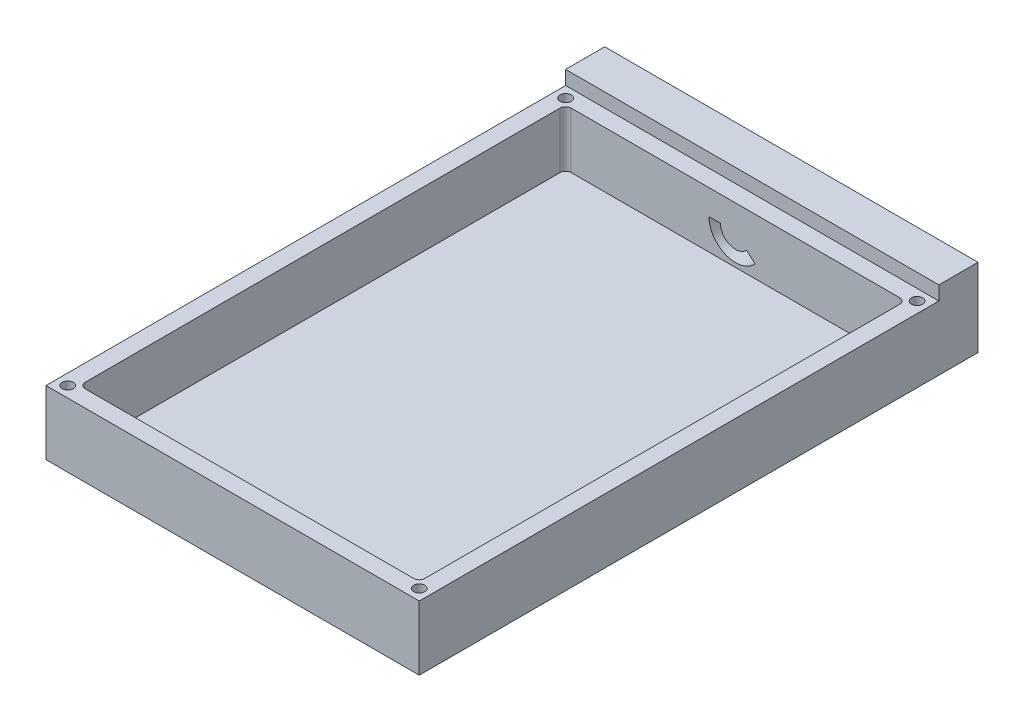
ISO-10303-21;
HEADER;
FILE_DESCRIPTION(('STEP AP214'),'2;1');
FILE_NAME('part.step','',(''),(''),'','','');
FILE_SCHEMA(('AUTOMOTIVE_DESIGN { 1 0 10303 214 1 1 1 1 }'));
ENDSEC;
DATA;
#1=APPLICATION_CONTEXT('core data for automotive mechanical design processes');
#2=APPLICATION_PROTOCOL_DEFINITION('international standard','automotive_design',2000,#1);
#3=PRODUCT_CONTEXT('',#1,'mechanical');
#4=PRODUCT('Part','Part','',(#3));
#5=PRODUCT_RELATED_PRODUCT_CATEGORY('part','',(#4));
#6=PRODUCT_DEFINITION_FORMATION('','',#4);
#7=PRODUCT_DEFINITION_CONTEXT('part definition',#1,'design');
#8=PRODUCT_DEFINITION('design','',#6,#7);
#9=PRODUCT_DEFINITION_SHAPE('','',#8);
#10=(LENGTH_UNIT() NAMED_UNIT(*) SI_UNIT(.MILLI.,.METRE.));
#11=(NAMED_UNIT(*) PLANE_ANGLE_UNIT() SI_UNIT($,.RADIAN.));
#12=(NAMED_UNIT(*) SI_UNIT($,.STERADIAN.) SOLID_ANGLE_UNIT());
#13=UNCERTAINTY_MEASURE_WITH_UNIT(LENGTH_MEASURE(1.E-05),#10,'distance_accuracy_value','');
#14=(GEOMETRIC_REPRESENTATION_CONTEXT(3) GLOBAL_UNCERTAINTY_ASSIGNED_CONTEXT((#13)) GLOBAL_UNIT_ASSIGNED_CONTEXT((#10,
#11,#12)) REPRESENTATION_CONTEXT('',''));
#15=CARTESIAN_POINT('',(0.,0.,0.));
#16=DIRECTION('',(0.,0.,1.));
#17=DIRECTION('',(1.,0.,0.));
#18=AXIS2_PLACEMENT_3D('',#15,#16,#17);
#19=CARTESIAN_POINT('',(0.,0.,0.));
#20=DIRECTION('',(0.,0.,1.));
#21=DIRECTION('',(1.,0.,0.));
#22=AXIS2_PLACEMENT_3D('',#19,#20,#21);
#23=PLANE('',#22);
#24=DIRECTION('',(0.,1.,0.));
#25=VECTOR('',#24,1.);
#26=CARTESIAN_POINT('',(33.4,7.,0.));
#27=LINE('',#26,#25);
#28=CARTESIAN_POINT('',(33.4,-7.,0.));
#29=VERTEX_POINT('',#28);
#30=CARTESIAN_POINT('',(33.4,7.,0.));
#31=VERTEX_POINT('',#30);
#32=EDGE_CURVE('E313',#29,#31,#27,.T.);
#33=ORIENTED_EDGE('',*,*,#32,.F.);
#34=DIRECTION('',(1.,0.,0.));
#35=VECTOR('',#34,1.);
#36=CARTESIAN_POINT('',(-33.4,-7.,0.));
#37=LINE('',#36,#35);
#38=CARTESIAN_POINT('',(-33.4,-7.,0.));
#39=VERTEX_POINT('',#38);
#40=EDGE_CURVE('E318',#39,#29,#37,.T.);
#41=ORIENTED_EDGE('',*,*,#40,.F.);
#42=DIRECTION('',(0.,-1.,0.));
#43=VECTOR('',#42,1.);
#44=CARTESIAN_POINT('',(-33.4,7.,0.));
#45=LINE('',#44,#43);
#46=CARTESIAN_POINT('',(-33.4,7.,0.));
#47=VERTEX_POINT('',#46);
#48=EDGE_CURVE('E332',#47,#39,#45,.T.);
#49=ORIENTED_EDGE('',*,*,#48,.F.);
#50=DIRECTION('',(-1.,0.,0.));
#51=VECTOR('',#50,1.);
#52=CARTESIAN_POINT('',(-33.4,7.,0.));
#53=LINE('',#52,#51);
#54=EDGE_CURVE('E329',#31,#47,#53,.T.);
#55=ORIENTED_EDGE('',*,*,#54,.F.);
#56=EDGE_LOOP('',(#33,#41,#49,#55));
#57=FACE_BOUND('',#56,.T.);
#58=CARTESIAN_POINT('',(0.,0.,0.));
#59=DIRECTION('',(0.,0.,1.));
#60=DIRECTION('',(1.,0.,0.));
#61=AXIS2_PLACEMENT_3D('',#58,#59,#60);
#62=CIRCLE('',#61,1.1);
#63=CARTESIAN_POINT('',(1.1,0.,0.));
#64=VERTEX_POINT('',#63);
#65=EDGE_CURVE('E309',#64,#64,#62,.T.);
#66=ORIENTED_EDGE('',*,*,#65,.T.);
#67=EDGE_LOOP('',(#66));
#68=FACE_BOUND('',#67,.T.);
#69=CARTESIAN_POINT('',(0.,0.,0.));
#70=DIRECTION('',(0.,0.,-1.));
#71=DIRECTION('',(-1.,0.,0.));
#72=AXIS2_PLACEMENT_3D('',#69,#70,#71);
#73=CIRCLE('',#72,4.75);
#74=CARTESIAN_POINT('',(3.5,-3.21130814466628,0.));
#75=VERTEX_POINT('',#74);
#76=CARTESIAN_POINT('',(-4.75,0.,0.));
#77=VERTEX_POINT('',#76);
#78=EDGE_CURVE('E198',#75,#77,#73,.T.);
#79=ORIENTED_EDGE('',*,*,#78,.F.);
#80=DIRECTION('',(0.736842105263144,-0.676064872561338,0.));
#81=VECTOR('',#80,1.);
#82=CARTESIAN_POINT('',(1.98947368421056,-1.82537515591554,0.));
#83=LINE('',#82,#81);
#84=CARTESIAN_POINT('',(1.98947368421056,-1.82537515591554,0.));
#85=VERTEX_POINT('',#84);
#86=EDGE_CURVE('E189',#85,#75,#83,.T.);
#87=ORIENTED_EDGE('',*,*,#86,.F.);
#88=CARTESIAN_POINT('',(0.,0.,0.));
#89=DIRECTION('',(0.,0.,1.));
#90=DIRECTION('',(-1.,0.,0.));
#91=AXIS2_PLACEMENT_3D('',#88,#89,#90);
#92=CIRCLE('',#91,2.7);
#93=CARTESIAN_POINT('',(-2.7,0.,0.));
#94=VERTEX_POINT('',#93);
#95=EDGE_CURVE('E202',#94,#85,#92,.T.);
#96=ORIENTED_EDGE('',*,*,#95,.F.);
#97=DIRECTION('',(1.,0.,0.));
#98=VECTOR('',#97,1.);
#99=CARTESIAN_POINT('',(-2.7,0.,0.));
#100=LINE('',#99,#98);
#101=EDGE_CURVE('E62',#77,#94,#100,.T.);
#102=ORIENTED_EDGE('',*,*,#101,.F.);
#103=EDGE_LOOP('',(#79,#87,#96,#102));
#104=FACE_BOUND('',#103,.T.);
#105=ADVANCED_FACE('F46',(#57,#68,#104),#23,.F.);
#106=CARTESIAN_POINT('',(30.4,4.5,9.99999999999999));
#107=DIRECTION('',(0.,0.,1.));
#108=DIRECTION('',(1.,0.,0.));
#109=AXIS2_PLACEMENT_3D('',#106,#107,#108);
#110=PLANE('',#109);
#111=DIRECTION('',(-1.,0.,0.));
#112=VECTOR('',#111,1.);
#113=CARTESIAN_POINT('',(30.4,-5.5,9.99999999999999));
#114=LINE('',#113,#112);
#115=CARTESIAN_POINT('',(29.4,-5.5,9.99999999999999));
#116=VERTEX_POINT('',#115);
#117=CARTESIAN_POINT('',(-29.4,-5.5,10.));
#118=VERTEX_POINT('',#117);
#119=EDGE_CURVE('E242',#116,#118,#114,.T.);
#120=ORIENTED_EDGE('',*,*,#119,.F.);
#121=DIRECTION('',(0.,-1.,0.));
#122=VECTOR('',#121,1.);
#123=CARTESIAN_POINT('',(29.4,4.5,9.99999999999999));
#124=LINE('',#123,#122);
#125=CARTESIAN_POINT('',(29.4,4.5,9.99999999999999));
#126=VERTEX_POINT('',#125);
#127=EDGE_CURVE('E389',#116,#126,#124,.F.);
#128=ORIENTED_EDGE('',*,*,#127,.T.);
#129=DIRECTION('',(-1.,0.,0.));
#130=VECTOR('',#129,1.);
#131=CARTESIAN_POINT('',(30.4,4.5,9.99999999999999));
#132=LINE('',#131,#130);
#133=CARTESIAN_POINT('',(-29.4,4.5,10.));
#134=VERTEX_POINT('',#133);
#135=EDGE_CURVE('E226',#126,#134,#132,.T.);
#136=ORIENTED_EDGE('',*,*,#135,.T.);
#137=DIRECTION('',(0.,-1.,0.));
#138=VECTOR('',#137,1.);
#139=CARTESIAN_POINT('',(-29.4,-5.5,10.));
#140=LINE('',#139,#138);
#141=EDGE_CURVE('E385',#134,#118,#140,.T.);
#142=ORIENTED_EDGE('',*,*,#141,.T.);
#143=EDGE_LOOP('',(#120,#128,#136,#142));
#144=FACE_BOUND('',#143,.T.);
#145=DIRECTION('',(0.736842105263144,-0.676064872561338,0.));
#146=VECTOR('',#145,1.);
#147=CARTESIAN_POINT('',(1.98947368421055,-1.82537515591554,10.));
#148=LINE('',#147,#146);
#149=CARTESIAN_POINT('',(1.98947368421056,-1.82537515591554,10.));
#150=VERTEX_POINT('',#149);
#151=CARTESIAN_POINT('',(3.5,-3.21130814466628,10.));
#152=VERTEX_POINT('',#151);
#153=EDGE_CURVE('E186',#150,#152,#148,.T.);
#154=ORIENTED_EDGE('',*,*,#153,.T.);
#155=CARTESIAN_POINT('',(0.,0.,10.));
#156=DIRECTION('',(0.,0.,1.));
#157=DIRECTION('',(1.,0.,0.));
#158=AXIS2_PLACEMENT_3D('',#155,#156,#157);
#159=CIRCLE('',#158,4.75);
#160=CARTESIAN_POINT('',(-4.75,0.,10.));
#161=VERTEX_POINT('',#160);
#162=EDGE_CURVE('E172',#152,#161,#159,.F.);
#163=ORIENTED_EDGE('',*,*,#162,.T.);
#164=DIRECTION('',(1.,0.,0.));
#165=VECTOR('',#164,1.);
#166=CARTESIAN_POINT('',(-2.7,0.,10.));
#167=LINE('',#166,#165);
#168=CARTESIAN_POINT('',(-2.7,0.,10.));
#169=VERTEX_POINT('',#168);
#170=EDGE_CURVE('E207',#161,#169,#167,.T.);
#171=ORIENTED_EDGE('',*,*,#170,.T.);
#172=CARTESIAN_POINT('',(0.,0.,10.));
#173=DIRECTION('',(0.,0.,1.));
#174=DIRECTION('',(1.,0.,0.));
#175=AXIS2_PLACEMENT_3D('',#172,#173,#174);
#176=CIRCLE('',#175,2.7);
#177=EDGE_CURVE('E194',#169,#150,#176,.T.);
#178=ORIENTED_EDGE('',*,*,#177,.T.);
#179=EDGE_LOOP('',(#154,#163,#171,#178));
#180=FACE_BOUND('',#179,.T.);
#181=ADVANCED_FACE('F193',(#144,#180),#110,.T.);
#182=CARTESIAN_POINT('',(0.,0.,7.));
#183=DIRECTION('',(0.,0.,1.));
#184=DIRECTION('',(1.,0.,0.));
#185=AXIS2_PLACEMENT_3D('',#182,#183,#184);
#186=PLANE('',#185);
#187=DIRECTION('',(-1.,0.,0.));
#188=VECTOR('',#187,1.);
#189=CARTESIAN_POINT('',(33.4,4.5,7.));
#190=LINE('',#189,#188);
#191=CARTESIAN_POINT('',(33.4,4.5,7.));
#192=VERTEX_POINT('',#191);
#193=CARTESIAN_POINT('',(-33.4,4.5,7.));
#194=VERTEX_POINT('',#193);
#195=EDGE_CURVE('E283',#192,#194,#190,.T.);
#196=ORIENTED_EDGE('',*,*,#195,.F.);
#197=DIRECTION('',(0.,1.,0.));
#198=VECTOR('',#197,1.);
#199=CARTESIAN_POINT('',(33.4,7.,7.));
#200=LINE('',#199,#198);
#201=CARTESIAN_POINT('',(33.4,7.,7.));
#202=VERTEX_POINT('',#201);
#203=EDGE_CURVE('E314',#192,#202,#200,.T.);
#204=ORIENTED_EDGE('',*,*,#203,.T.);
#205=DIRECTION('',(-1.,0.,0.));
#206=VECTOR('',#205,1.);
#207=CARTESIAN_POINT('',(-33.4,7.,7.));
#208=LINE('',#207,#206);
#209=CARTESIAN_POINT('',(-33.4,7.,7.));
#210=VERTEX_POINT('',#209);
#211=EDGE_CURVE('E317',#202,#210,#208,.T.);
#212=ORIENTED_EDGE('',*,*,#211,.T.);
#213=DIRECTION('',(0.,-1.,0.));
#214=VECTOR('',#213,1.);
#215=CARTESIAN_POINT('',(-33.4,7.,7.));
#216=LINE('',#215,#214);
#217=EDGE_CURVE('E321',#210,#194,#216,.T.);
#218=ORIENTED_EDGE('',*,*,#217,.T.);
#219=EDGE_LOOP('',(#196,#204,#212,#218));
#220=FACE_BOUND('',#219,.T.);
#221=ADVANCED_FACE('F456',(#220),#186,.T.);
#222=CARTESIAN_POINT('',(33.4,7.,7.));
#223=DIRECTION('',(-1.,0.,0.));
#224=DIRECTION('',(0.,0.,1.));
#225=AXIS2_PLACEMENT_3D('',#222,#223,#224);
#226=PLANE('',#225);
#227=ORIENTED_EDGE('',*,*,#203,.F.);
#228=DIRECTION('',(0.,0.,-1.));
#229=VECTOR('',#228,1.);
#230=CARTESIAN_POINT('',(33.4,4.5,100.));
#231=LINE('',#230,#229);
#232=CARTESIAN_POINT('',(33.4,4.5,100.));
#233=VERTEX_POINT('',#232);
#234=EDGE_CURVE('E277',#233,#192,#231,.T.);
#235=ORIENTED_EDGE('',*,*,#234,.F.);
#236=DIRECTION('',(0.,1.,0.));
#237=VECTOR('',#236,1.);
#238=CARTESIAN_POINT('',(33.4,-7.,100.));
#239=LINE('',#238,#237);
#240=CARTESIAN_POINT('',(33.4,-7.,100.));
#241=VERTEX_POINT('',#240);
#242=EDGE_CURVE('E306',#241,#233,#239,.T.);
#243=ORIENTED_EDGE('',*,*,#242,.F.);
#244=DIRECTION('',(0.,0.,-1.));
#245=VECTOR('',#244,1.);
#246=CARTESIAN_POINT('',(33.4,-7.,7.));
#247=LINE('',#246,#245);
#248=EDGE_CURVE('E325',#241,#29,#247,.T.);
#249=ORIENTED_EDGE('',*,*,#248,.T.);
#250=ORIENTED_EDGE('',*,*,#32,.T.);
#251=DIRECTION('',(0.,0.,-1.));
#252=VECTOR('',#251,1.);
#253=CARTESIAN_POINT('',(33.4,7.,7.));
#254=LINE('',#253,#252);
#255=EDGE_CURVE('E348',#202,#31,#254,.T.);
#256=ORIENTED_EDGE('',*,*,#255,.F.);
#257=EDGE_LOOP('',(#227,#235,#243,#249,#250,#256));
#258=FACE_BOUND('',#257,.T.);
#259=ADVANCED_FACE('F474',(#258),#226,.F.);
#260=CARTESIAN_POINT('',(-33.4,7.,7.));
#261=DIRECTION('',(0.,-1.,0.));
#262=DIRECTION('',(0.,0.,-1.));
#263=AXIS2_PLACEMENT_3D('',#260,#261,#262);
#264=PLANE('',#263);
#265=ORIENTED_EDGE('',*,*,#54,.T.);
#266=DIRECTION('',(0.,0.,-1.));
#267=VECTOR('',#266,1.);
#268=CARTESIAN_POINT('',(-33.4,7.,7.));
#269=LINE('',#268,#267);
#270=EDGE_CURVE('E344',#210,#47,#269,.T.);
#271=ORIENTED_EDGE('',*,*,#270,.F.);
#272=ORIENTED_EDGE('',*,*,#211,.F.);
#273=ORIENTED_EDGE('',*,*,#255,.T.);
#274=EDGE_LOOP('',(#265,#271,#272,#273));
#275=FACE_BOUND('',#274,.T.);
#276=ADVANCED_FACE('F471',(#275),#264,.F.);
#277=CARTESIAN_POINT('',(-33.4,7.,7.));
#278=DIRECTION('',(1.,0.,0.));
#279=DIRECTION('',(0.,0.,-1.));
#280=AXIS2_PLACEMENT_3D('',#277,#278,#279);
#281=PLANE('',#280);
#282=ORIENTED_EDGE('',*,*,#48,.T.);
#283=DIRECTION('',(0.,0.,-1.));
#284=VECTOR('',#283,1.);
#285=CARTESIAN_POINT('',(-33.4,-7.,7.));
#286=LINE('',#285,#284);
#287=CARTESIAN_POINT('',(-33.4,-7.,100.));
#288=VERTEX_POINT('',#287);
#289=EDGE_CURVE('E340',#288,#39,#286,.T.);
#290=ORIENTED_EDGE('',*,*,#289,.F.);
#291=DIRECTION('',(0.,-1.,0.));
#292=VECTOR('',#291,1.);
#293=CARTESIAN_POINT('',(-33.4,-7.,100.));
#294=LINE('',#293,#292);
#295=CARTESIAN_POINT('',(-33.4,4.5,100.));
#296=VERTEX_POINT('',#295);
#297=EDGE_CURVE('E298',#296,#288,#294,.T.);
#298=ORIENTED_EDGE('',*,*,#297,.F.);
#299=DIRECTION('',(0.,0.,1.));
#300=VECTOR('',#299,1.);
#301=CARTESIAN_POINT('',(-33.4,4.5,100.));
#302=LINE('',#301,#300);
#303=EDGE_CURVE('E286',#194,#296,#302,.T.);
#304=ORIENTED_EDGE('',*,*,#303,.F.);
#305=ORIENTED_EDGE('',*,*,#217,.F.);
#306=ORIENTED_EDGE('',*,*,#270,.T.);
#307=EDGE_LOOP('',(#282,#290,#298,#304,#305,#306));
#308=FACE_BOUND('',#307,.T.);
#309=ADVANCED_FACE('F467',(#308),#281,.F.);
#310=CARTESIAN_POINT('',(-33.4,-7.,7.));
#311=DIRECTION('',(0.,1.,0.));
#312=DIRECTION('',(0.,0.,1.));
#313=AXIS2_PLACEMENT_3D('',#310,#311,#312);
#314=PLANE('',#313);
#315=ORIENTED_EDGE('',*,*,#40,.T.);
#316=ORIENTED_EDGE('',*,*,#248,.F.);
#317=DIRECTION('',(1.,0.,0.));
#318=VECTOR('',#317,1.);
#319=CARTESIAN_POINT('',(-33.4,-7.,100.));
#320=LINE('',#319,#318);
#321=EDGE_CURVE('E302',#288,#241,#320,.T.);
#322=ORIENTED_EDGE('',*,*,#321,.F.);
#323=ORIENTED_EDGE('',*,*,#289,.T.);
#324=EDGE_LOOP('',(#315,#316,#322,#323));
#325=FACE_BOUND('',#324,.T.);
#326=ADVANCED_FACE('F463',(#325),#314,.F.);
#327=CARTESIAN_POINT('',(0.,0.,7.));
#328=DIRECTION('',(0.,0.,-1.));
#329=DIRECTION('',(-1.,0.,0.));
#330=AXIS2_PLACEMENT_3D('',#327,#328,#329);
#331=CYLINDRICAL_SURFACE('',#330,1.1);
#332=CARTESIAN_POINT('',(0.,0.,7.));
#333=DIRECTION('',(0.,0.,1.));
#334=DIRECTION('',(1.,0.,0.));
#335=AXIS2_PLACEMENT_3D('',#332,#333,#334);
#336=CIRCLE('',#335,1.1);
#337=CARTESIAN_POINT('',(1.1,0.,7.));
#338=VERTEX_POINT('',#337);
#339=EDGE_CURVE('E294',#338,#338,#336,.T.);
#340=ORIENTED_EDGE('',*,*,#339,.T.);
#341=EDGE_LOOP('',(#340));
#342=FACE_BOUND('',#341,.T.);
#343=ORIENTED_EDGE('',*,*,#65,.F.);
#344=EDGE_LOOP('',(#343));
#345=FACE_BOUND('',#344,.T.);
#346=ADVANCED_FACE('F466',(#342,#345),#331,.F.);
#347=CARTESIAN_POINT('',(0.,0.,100.));
#348=DIRECTION('',(0.,0.,-1.));
#349=DIRECTION('',(-1.,0.,0.));
#350=AXIS2_PLACEMENT_3D('',#347,#348,#349);
#351=PLANE('',#350);
#352=ORIENTED_EDGE('',*,*,#297,.T.);
#353=ORIENTED_EDGE('',*,*,#321,.T.);
#354=ORIENTED_EDGE('',*,*,#242,.T.);
#355=DIRECTION('',(1.,0.,0.));
#356=VECTOR('',#355,1.);
#357=CARTESIAN_POINT('',(33.4,4.5,100.));
#358=LINE('',#357,#356);
#359=EDGE_CURVE('E290',#296,#233,#358,.T.);
#360=ORIENTED_EDGE('',*,*,#359,.F.);
#361=EDGE_LOOP('',(#352,#353,#354,#360));
#362=FACE_BOUND('',#361,.T.);
#363=ADVANCED_FACE('F496',(#362),#351,.F.);
#364=CARTESIAN_POINT('',(-30.4,4.5,97.));
#365=DIRECTION('',(1.,0.,0.));
#366=DIRECTION('',(0.,0.,-1.));
#367=AXIS2_PLACEMENT_3D('',#364,#365,#366);
#368=PLANE('',#367);
#369=DIRECTION('',(0.,0.,1.));
#370=VECTOR('',#369,1.);
#371=CARTESIAN_POINT('',(-30.4,4.5,97.));
#372=LINE('',#371,#370);
#373=CARTESIAN_POINT('',(-30.4,4.5,11.));
#374=VERTEX_POINT('',#373);
#375=CARTESIAN_POINT('',(-30.4,4.5,96.));
#376=VERTEX_POINT('',#375);
#377=EDGE_CURVE('E230',#374,#376,#372,.T.);
#378=ORIENTED_EDGE('',*,*,#377,.T.);
#379=DIRECTION('',(0.,-1.,0.));
#380=VECTOR('',#379,1.);
#381=CARTESIAN_POINT('',(-30.4,-5.5,96.));
#382=LINE('',#381,#380);
#383=CARTESIAN_POINT('',(-30.4,-5.5,96.));
#384=VERTEX_POINT('',#383);
#385=EDGE_CURVE('E381',#376,#384,#382,.T.);
#386=ORIENTED_EDGE('',*,*,#385,.T.);
#387=DIRECTION('',(0.,0.,1.));
#388=VECTOR('',#387,1.);
#389=CARTESIAN_POINT('',(-30.4,-5.5,97.));
#390=LINE('',#389,#388);
#391=CARTESIAN_POINT('',(-30.4,-5.5,11.));
#392=VERTEX_POINT('',#391);
#393=EDGE_CURVE('E222',#392,#384,#390,.T.);
#394=ORIENTED_EDGE('',*,*,#393,.F.);
#395=DIRECTION('',(0.,-1.,0.));
#396=VECTOR('',#395,1.);
#397=CARTESIAN_POINT('',(-30.4,4.5,11.));
#398=LINE('',#397,#396);
#399=EDGE_CURVE('E378',#392,#374,#398,.F.);
#400=ORIENTED_EDGE('',*,*,#399,.T.);
#401=EDGE_LOOP('',(#378,#386,#394,#400));
#402=FACE_BOUND('',#401,.T.);
#403=ADVANCED_FACE('F422',(#402),#368,.T.);
#404=CARTESIAN_POINT('',(30.4,4.5,97.));
#405=DIRECTION('',(-1.,0.,0.));
#406=DIRECTION('',(0.,0.,1.));
#407=AXIS2_PLACEMENT_3D('',#404,#405,#406);
#408=PLANE('',#407);
#409=DIRECTION('',(0.,0.,-1.));
#410=VECTOR('',#409,1.);
#411=CARTESIAN_POINT('',(30.4,-5.5,97.));
#412=LINE('',#411,#410);
#413=CARTESIAN_POINT('',(30.4,-5.5,96.));
#414=VERTEX_POINT('',#413);
#415=CARTESIAN_POINT('',(30.4,-5.5,11.));
#416=VERTEX_POINT('',#415);
#417=EDGE_CURVE('E238',#414,#416,#412,.T.);
#418=ORIENTED_EDGE('',*,*,#417,.F.);
#419=DIRECTION('',(0.,-1.,0.));
#420=VECTOR('',#419,1.);
#421=CARTESIAN_POINT('',(30.4,4.5,96.));
#422=LINE('',#421,#420);
#423=CARTESIAN_POINT('',(30.4,4.5,96.));
#424=VERTEX_POINT('',#423);
#425=EDGE_CURVE('E375',#414,#424,#422,.F.);
#426=ORIENTED_EDGE('',*,*,#425,.T.);
#427=DIRECTION('',(0.,0.,-1.));
#428=VECTOR('',#427,1.);
#429=CARTESIAN_POINT('',(30.4,4.5,97.));
#430=LINE('',#429,#428);
#431=CARTESIAN_POINT('',(30.4,4.5,11.));
#432=VERTEX_POINT('',#431);
#433=EDGE_CURVE('E221',#424,#432,#430,.T.);
#434=ORIENTED_EDGE('',*,*,#433,.T.);
#435=DIRECTION('',(0.,-1.,0.));
#436=VECTOR('',#435,1.);
#437=CARTESIAN_POINT('',(30.4,-5.5,11.));
#438=LINE('',#437,#436);
#439=EDGE_CURVE('E371',#432,#416,#438,.T.);
#440=ORIENTED_EDGE('',*,*,#439,.T.);
#441=EDGE_LOOP('',(#418,#426,#434,#440));
#442=FACE_BOUND('',#441,.T.);
#443=ADVANCED_FACE('F409',(#442),#408,.T.);
#444=CARTESIAN_POINT('',(30.4,4.5,97.));
#445=DIRECTION('',(0.,0.,-1.));
#446=DIRECTION('',(-1.,0.,0.));
#447=AXIS2_PLACEMENT_3D('',#444,#445,#446);
#448=PLANE('',#447);
#449=DIRECTION('',(1.,0.,0.));
#450=VECTOR('',#449,1.);
#451=CARTESIAN_POINT('',(30.4,4.5,97.));
#452=LINE('',#451,#450);
#453=CARTESIAN_POINT('',(-29.4,4.5,97.));
#454=VERTEX_POINT('',#453);
#455=CARTESIAN_POINT('',(29.4,4.5,97.));
#456=VERTEX_POINT('',#455);
#457=EDGE_CURVE('E217',#454,#456,#452,.T.);
#458=ORIENTED_EDGE('',*,*,#457,.T.);
#459=DIRECTION('',(0.,-1.,0.));
#460=VECTOR('',#459,1.);
#461=CARTESIAN_POINT('',(29.4,-5.5,97.));
#462=LINE('',#461,#460);
#463=CARTESIAN_POINT('',(29.4,-5.5,97.));
#464=VERTEX_POINT('',#463);
#465=EDGE_CURVE('E355',#456,#464,#462,.T.);
#466=ORIENTED_EDGE('',*,*,#465,.T.);
#467=DIRECTION('',(1.,0.,0.));
#468=VECTOR('',#467,1.);
#469=CARTESIAN_POINT('',(30.4,-5.5,97.));
#470=LINE('',#469,#468);
#471=CARTESIAN_POINT('',(-29.4,-5.5,97.));
#472=VERTEX_POINT('',#471);
#473=EDGE_CURVE('E216',#472,#464,#470,.T.);
#474=ORIENTED_EDGE('',*,*,#473,.F.);
#475=DIRECTION('',(0.,-1.,0.));
#476=VECTOR('',#475,1.);
#477=CARTESIAN_POINT('',(-29.4,4.5,97.));
#478=LINE('',#477,#476);
#479=EDGE_CURVE('E352',#472,#454,#478,.F.);
#480=ORIENTED_EDGE('',*,*,#479,.T.);
#481=EDGE_LOOP('',(#458,#466,#474,#480));
#482=FACE_BOUND('',#481,.T.);
#483=ADVANCED_FACE('F431',(#482),#448,.T.);
#484=CARTESIAN_POINT('',(-31.45,4.5,98.05));
#485=DIRECTION('',(0.,-1.,0.));
#486=DIRECTION('',(0.,0.,-1.));
#487=AXIS2_PLACEMENT_3D('',#484,#485,#486);
#488=CYLINDRICAL_SURFACE('',#487,1.);
#489=CARTESIAN_POINT('',(-31.45,4.5,98.05));
#490=DIRECTION('',(0.,1.,0.));
#491=DIRECTION('',(0.,0.,1.));
#492=AXIS2_PLACEMENT_3D('',#489,#490,#491);
#493=CIRCLE('',#492,1.);
#494=CARTESIAN_POINT('',(-31.45,4.5,99.05));
#495=VERTEX_POINT('',#494);
#496=EDGE_CURVE('E249',#495,#495,#493,.T.);
#497=ORIENTED_EDGE('',*,*,#496,.T.);
#498=EDGE_LOOP('',(#497));
#499=FACE_BOUND('',#498,.T.);
#500=CARTESIAN_POINT('',(-31.45,-5.5,98.05));
#501=DIRECTION('',(0.,1.,0.));
#502=DIRECTION('',(0.,0.,1.));
#503=AXIS2_PLACEMENT_3D('',#500,#501,#502);
#504=CIRCLE('',#503,1.);
#505=CARTESIAN_POINT('',(-31.45,-5.5,99.05));
#506=VERTEX_POINT('',#505);
#507=EDGE_CURVE('E234',#506,#506,#504,.T.);
#508=ORIENTED_EDGE('',*,*,#507,.F.);
#509=EDGE_LOOP('',(#508));
#510=FACE_BOUND('',#509,.T.);
#511=ADVANCED_FACE('F541',(#499,#510),#488,.F.);
#512=CARTESIAN_POINT('',(31.45,4.5,98.05));
#513=DIRECTION('',(0.,-1.,0.));
#514=DIRECTION('',(0.,0.,-1.));
#515=AXIS2_PLACEMENT_3D('',#512,#513,#514);
#516=CYLINDRICAL_SURFACE('',#515,0.999999999999998);
#517=CARTESIAN_POINT('',(31.45,4.5,98.05));
#518=DIRECTION('',(0.,1.,0.));
#519=DIRECTION('',(0.,0.,1.));
#520=AXIS2_PLACEMENT_3D('',#517,#518,#519);
#521=CIRCLE('',#520,0.999999999999998);
#522=CARTESIAN_POINT('',(31.45,4.5,99.05));
#523=VERTEX_POINT('',#522);
#524=EDGE_CURVE('E257',#523,#523,#521,.T.);
#525=ORIENTED_EDGE('',*,*,#524,.T.);
#526=EDGE_LOOP('',(#525));
#527=FACE_BOUND('',#526,.T.);
#528=CARTESIAN_POINT('',(31.45,-5.5,98.05));
#529=DIRECTION('',(0.,1.,0.));
#530=DIRECTION('',(0.,0.,1.));
#531=AXIS2_PLACEMENT_3D('',#528,#529,#530);
#532=CIRCLE('',#531,0.999999999999998);
#533=CARTESIAN_POINT('',(31.45,-5.5,99.05));
#534=VERTEX_POINT('',#533);
#535=EDGE_CURVE('E253',#534,#534,#532,.T.);
#536=ORIENTED_EDGE('',*,*,#535,.F.);
#537=EDGE_LOOP('',(#536));
#538=FACE_BOUND('',#537,.T.);
#539=ADVANCED_FACE('F535',(#527,#538),#516,.F.);
#540=CARTESIAN_POINT('',(31.45,4.5,8.95));
#541=DIRECTION('',(0.,-1.,0.));
#542=DIRECTION('',(0.,0.,-1.));
#543=AXIS2_PLACEMENT_3D('',#540,#541,#542);
#544=CYLINDRICAL_SURFACE('',#543,0.999999999999991);
#545=CARTESIAN_POINT('',(31.45,4.5,8.95));
#546=DIRECTION('',(0.,1.,0.));
#547=DIRECTION('',(0.,0.,1.));
#548=AXIS2_PLACEMENT_3D('',#545,#546,#547);
#549=CIRCLE('',#548,0.999999999999991);
#550=CARTESIAN_POINT('',(31.45,4.5,9.94999999999999));
#551=VERTEX_POINT('',#550);
#552=EDGE_CURVE('E265',#551,#551,#549,.T.);
#553=ORIENTED_EDGE('',*,*,#552,.T.);
#554=EDGE_LOOP('',(#553));
#555=FACE_BOUND('',#554,.T.);
#556=CARTESIAN_POINT('',(31.45,-5.5,8.95));
#557=DIRECTION('',(0.,1.,0.));
#558=DIRECTION('',(0.,0.,1.));
#559=AXIS2_PLACEMENT_3D('',#556,#557,#558);
#560=CIRCLE('',#559,0.999999999999991);
#561=CARTESIAN_POINT('',(31.45,-5.5,9.94999999999999));
#562=VERTEX_POINT('',#561);
#563=EDGE_CURVE('E261',#562,#562,#560,.T.);
#564=ORIENTED_EDGE('',*,*,#563,.F.);
#565=EDGE_LOOP('',(#564));
#566=FACE_BOUND('',#565,.T.);
#567=ADVANCED_FACE('F529',(#555,#566),#544,.F.);
#568=CARTESIAN_POINT('',(-31.45,4.5,8.95));
#569=DIRECTION('',(0.,-1.,0.));
#570=DIRECTION('',(0.,0.,-1.));
#571=AXIS2_PLACEMENT_3D('',#568,#569,#570);
#572=CYLINDRICAL_SURFACE('',#571,1.);
#573=CARTESIAN_POINT('',(-31.45,4.5,8.95));
#574=DIRECTION('',(0.,1.,0.));
#575=DIRECTION('',(0.,0.,1.));
#576=AXIS2_PLACEMENT_3D('',#573,#574,#575);
#577=CIRCLE('',#576,1.);
#578=CARTESIAN_POINT('',(-31.45,4.5,9.95));
#579=VERTEX_POINT('',#578);
#580=EDGE_CURVE('E273',#579,#579,#577,.T.);
#581=ORIENTED_EDGE('',*,*,#580,.T.);
#582=EDGE_LOOP('',(#581));
#583=FACE_BOUND('',#582,.T.);
#584=CARTESIAN_POINT('',(-31.45,-5.5,8.95));
#585=DIRECTION('',(0.,1.,0.));
#586=DIRECTION('',(0.,0.,1.));
#587=AXIS2_PLACEMENT_3D('',#584,#585,#586);
#588=CIRCLE('',#587,1.);
#589=CARTESIAN_POINT('',(-31.45,-5.5,9.95));
#590=VERTEX_POINT('',#589);
#591=EDGE_CURVE('E269',#590,#590,#588,.T.);
#592=ORIENTED_EDGE('',*,*,#591,.F.);
#593=EDGE_LOOP('',(#592));
#594=FACE_BOUND('',#593,.T.);
#595=ADVANCED_FACE('F517',(#583,#594),#572,.F.);
#596=CARTESIAN_POINT('',(0.,4.5,0.));
#597=DIRECTION('',(0.,1.,0.));
#598=DIRECTION('',(0.,0.,1.));
#599=AXIS2_PLACEMENT_3D('',#596,#597,#598);
#600=PLANE('',#599);
#601=ORIENTED_EDGE('',*,*,#524,.F.);
#602=EDGE_LOOP('',(#601));
#603=FACE_BOUND('',#602,.T.);
#604=ORIENTED_EDGE('',*,*,#580,.F.);
#605=EDGE_LOOP('',(#604));
#606=FACE_BOUND('',#605,.T.);
#607=ORIENTED_EDGE('',*,*,#234,.T.);
#608=ORIENTED_EDGE('',*,*,#195,.T.);
#609=ORIENTED_EDGE('',*,*,#303,.T.);
#610=ORIENTED_EDGE('',*,*,#359,.T.);
#611=EDGE_LOOP('',(#607,#608,#609,#610));
#612=FACE_BOUND('',#611,.T.);
#613=ORIENTED_EDGE('',*,*,#552,.F.);
#614=EDGE_LOOP('',(#613));
#615=FACE_BOUND('',#614,.T.);
#616=ORIENTED_EDGE('',*,*,#496,.F.);
#617=EDGE_LOOP('',(#616));
#618=FACE_BOUND('',#617,.T.);
#619=ORIENTED_EDGE('',*,*,#433,.F.);
#620=CARTESIAN_POINT('',(29.4,4.5,96.));
#621=DIRECTION('',(0.,1.,0.));
#622=DIRECTION('',(0.,0.,1.));
#623=AXIS2_PLACEMENT_3D('',#620,#621,#622);
#624=CIRCLE('',#623,1.);
#625=EDGE_CURVE('E392',#424,#456,#624,.F.);
#626=ORIENTED_EDGE('',*,*,#625,.T.);
#627=ORIENTED_EDGE('',*,*,#457,.F.);
#628=CARTESIAN_POINT('',(-29.4,4.5,96.));
#629=DIRECTION('',(0.,1.,0.));
#630=DIRECTION('',(0.,0.,1.));
#631=AXIS2_PLACEMENT_3D('',#628,#629,#630);
#632=CIRCLE('',#631,1.);
#633=EDGE_CURVE('E395',#454,#376,#632,.F.);
#634=ORIENTED_EDGE('',*,*,#633,.T.);
#635=ORIENTED_EDGE('',*,*,#377,.F.);
#636=CARTESIAN_POINT('',(-29.4,4.5,11.));
#637=DIRECTION('',(0.,1.,0.));
#638=DIRECTION('',(0.,0.,1.));
#639=AXIS2_PLACEMENT_3D('',#636,#637,#638);
#640=CIRCLE('',#639,1.);
#641=EDGE_CURVE('E11',#374,#134,#640,.F.);
#642=ORIENTED_EDGE('',*,*,#641,.T.);
#643=ORIENTED_EDGE('',*,*,#135,.F.);
#644=CARTESIAN_POINT('',(29.4,4.5,11.));
#645=DIRECTION('',(0.,1.,0.));
#646=DIRECTION('',(0.,0.,1.));
#647=AXIS2_PLACEMENT_3D('',#644,#645,#646);
#648=CIRCLE('',#647,1.);
#649=EDGE_CURVE('E55',#126,#432,#648,.F.);
#650=ORIENTED_EDGE('',*,*,#649,.T.);
#651=EDGE_LOOP('',(#619,#626,#627,#634,#635,#642,#643,#650));
#652=FACE_BOUND('',#651,.T.);
#653=ADVANCED_FACE('F402',(#603,#606,#612,#615,#618,#652),#600,.T.);
#654=CARTESIAN_POINT('',(-33.4,-5.5,100.));
#655=DIRECTION('',(0.,-1.,0.));
#656=DIRECTION('',(0.,0.,-1.));
#657=AXIS2_PLACEMENT_3D('',#654,#655,#656);
#658=PLANE('',#657);
#659=ORIENTED_EDGE('',*,*,#473,.T.);
#660=CARTESIAN_POINT('',(29.4,-5.5,96.));
#661=DIRECTION('',(0.,-1.,0.));
#662=DIRECTION('',(0.,0.,-1.));
#663=AXIS2_PLACEMENT_3D('',#660,#661,#662);
#664=CIRCLE('',#663,1.);
#665=EDGE_CURVE('E368',#464,#414,#664,.F.);
#666=ORIENTED_EDGE('',*,*,#665,.T.);
#667=ORIENTED_EDGE('',*,*,#417,.T.);
#668=CARTESIAN_POINT('',(29.4,-5.5,11.));
#669=DIRECTION('',(0.,-1.,0.));
#670=DIRECTION('',(0.,0.,-1.));
#671=AXIS2_PLACEMENT_3D('',#668,#669,#670);
#672=CIRCLE('',#671,1.);
#673=EDGE_CURVE('E362',#416,#116,#672,.F.);
#674=ORIENTED_EDGE('',*,*,#673,.T.);
#675=ORIENTED_EDGE('',*,*,#119,.T.);
#676=CARTESIAN_POINT('',(-29.4,-5.5,11.));
#677=DIRECTION('',(0.,-1.,0.));
#678=DIRECTION('',(0.,0.,-1.));
#679=AXIS2_PLACEMENT_3D('',#676,#677,#678);
#680=CIRCLE('',#679,1.);
#681=EDGE_CURVE('E359',#118,#392,#680,.F.);
#682=ORIENTED_EDGE('',*,*,#681,.T.);
#683=ORIENTED_EDGE('',*,*,#393,.T.);
#684=CARTESIAN_POINT('',(-29.4,-5.5,96.));
#685=DIRECTION('',(0.,-1.,0.));
#686=DIRECTION('',(0.,0.,-1.));
#687=AXIS2_PLACEMENT_3D('',#684,#685,#686);
#688=CIRCLE('',#687,1.);
#689=EDGE_CURVE('E365',#384,#472,#688,.F.);
#690=ORIENTED_EDGE('',*,*,#689,.T.);
#691=EDGE_LOOP('',(#659,#666,#667,#674,#675,#682,#683,#690));
#692=FACE_BOUND('',#691,.T.);
#693=ADVANCED_FACE('F414',(#692),#658,.F.);
#694=ORIENTED_EDGE('',*,*,#507,.T.);
#695=EDGE_LOOP('',(#694));
#696=FACE_BOUND('',#695,.T.);
#697=ADVANCED_FACE('F510',(#696),#658,.F.);
#698=ORIENTED_EDGE('',*,*,#535,.T.);
#699=EDGE_LOOP('',(#698));
#700=FACE_BOUND('',#699,.T.);
#701=ADVANCED_FACE('F515',(#700),#658,.F.);
#702=ORIENTED_EDGE('',*,*,#563,.T.);
#703=EDGE_LOOP('',(#702));
#704=FACE_BOUND('',#703,.T.);
#705=ADVANCED_FACE('F520',(#704),#658,.F.);
#706=ORIENTED_EDGE('',*,*,#591,.T.);
#707=EDGE_LOOP('',(#706));
#708=FACE_BOUND('',#707,.T.);
#709=ADVANCED_FACE('F445',(#708),#658,.F.);
#710=CARTESIAN_POINT('',(33.4,4.5,7.));
#711=DIRECTION('',(0.,0.,1.));
#712=DIRECTION('',(1.,0.,0.));
#713=AXIS2_PLACEMENT_3D('',#710,#711,#712);
#714=PLANE('',#713);
#715=ORIENTED_EDGE('',*,*,#339,.F.);
#716=EDGE_LOOP('',(#715));
#717=FACE_BOUND('',#716,.T.);
#718=ADVANCED_FACE('F437',(#717),#714,.F.);
#719=CARTESIAN_POINT('',(29.4,4.5,96.));
#720=DIRECTION('',(0.,1.,0.));
#721=DIRECTION('',(0.,0.,1.));
#722=AXIS2_PLACEMENT_3D('',#719,#720,#721);
#723=CYLINDRICAL_SURFACE('',#722,1.);
#724=ORIENTED_EDGE('',*,*,#625,.F.);
#725=ORIENTED_EDGE('',*,*,#425,.F.);
#726=ORIENTED_EDGE('',*,*,#665,.F.);
#727=ORIENTED_EDGE('',*,*,#465,.F.);
#728=EDGE_LOOP('',(#724,#725,#726,#727));
#729=FACE_BOUND('',#728,.T.);
#730=ADVANCED_FACE('F435',(#729),#723,.F.);
#731=CARTESIAN_POINT('',(-29.4,4.5,96.));
#732=DIRECTION('',(0.,1.,0.));
#733=DIRECTION('',(0.,0.,1.));
#734=AXIS2_PLACEMENT_3D('',#731,#732,#733);
#735=CYLINDRICAL_SURFACE('',#734,1.);
#736=ORIENTED_EDGE('',*,*,#633,.F.);
#737=ORIENTED_EDGE('',*,*,#479,.F.);
#738=ORIENTED_EDGE('',*,*,#689,.F.);
#739=ORIENTED_EDGE('',*,*,#385,.F.);
#740=EDGE_LOOP('',(#736,#737,#738,#739));
#741=FACE_BOUND('',#740,.T.);
#742=ADVANCED_FACE('F427',(#741),#735,.F.);
#743=CARTESIAN_POINT('',(29.4,4.5,11.));
#744=DIRECTION('',(0.,1.,0.));
#745=DIRECTION('',(0.,0.,1.));
#746=AXIS2_PLACEMENT_3D('',#743,#744,#745);
#747=CYLINDRICAL_SURFACE('',#746,1.);
#748=ORIENTED_EDGE('',*,*,#649,.F.);
#749=ORIENTED_EDGE('',*,*,#127,.F.);
#750=ORIENTED_EDGE('',*,*,#673,.F.);
#751=ORIENTED_EDGE('',*,*,#439,.F.);
#752=EDGE_LOOP('',(#748,#749,#750,#751));
#753=FACE_BOUND('',#752,.T.);
#754=ADVANCED_FACE('F411',(#753),#747,.F.);
#755=CARTESIAN_POINT('',(-29.4,4.5,11.));
#756=DIRECTION('',(0.,1.,0.));
#757=DIRECTION('',(0.,0.,1.));
#758=AXIS2_PLACEMENT_3D('',#755,#756,#757);
#759=CYLINDRICAL_SURFACE('',#758,1.);
#760=ORIENTED_EDGE('',*,*,#641,.F.);
#761=ORIENTED_EDGE('',*,*,#399,.F.);
#762=ORIENTED_EDGE('',*,*,#681,.F.);
#763=ORIENTED_EDGE('',*,*,#141,.F.);
#764=EDGE_LOOP('',(#760,#761,#762,#763));
#765=FACE_BOUND('',#764,.T.);
#766=ADVANCED_FACE('F48',(#765),#759,.F.);
#767=CARTESIAN_POINT('',(1.98947368421056,-1.82537515591554,19.5197163823299));
#768=DIRECTION('',(0.676064872561338,0.736842105263144,0.));
#769=DIRECTION('',(-0.736842105263144,0.676064872561338,0.));
#770=AXIS2_PLACEMENT_3D('',#767,#768,#769);
#771=PLANE('',#770);
#772=DIRECTION('',(0.,0.,-1.));
#773=VECTOR('',#772,1.);
#774=CARTESIAN_POINT('',(1.98947368421056,-1.82537515591554,19.5197163823299));
#775=LINE('',#774,#773);
#776=EDGE_CURVE('E70',#150,#85,#775,.T.);
#777=ORIENTED_EDGE('',*,*,#776,.T.);
#778=ORIENTED_EDGE('',*,*,#86,.T.);
#779=DIRECTION('',(0.,0.,-1.));
#780=VECTOR('',#779,1.);
#781=CARTESIAN_POINT('',(3.5,-3.21130814466628,19.5197163823299));
#782=LINE('',#781,#780);
#783=EDGE_CURVE('E176',#152,#75,#782,.T.);
#784=ORIENTED_EDGE('',*,*,#783,.F.);
#785=ORIENTED_EDGE('',*,*,#153,.F.);
#786=EDGE_LOOP('',(#777,#778,#784,#785));
#787=FACE_BOUND('',#786,.T.);
#788=ADVANCED_FACE('F185',(#787),#771,.F.);
#789=CARTESIAN_POINT('',(0.,0.,19.5197163823299));
#790=DIRECTION('',(0.,0.,-1.));
#791=DIRECTION('',(-1.,0.,0.));
#792=AXIS2_PLACEMENT_3D('',#789,#790,#791);
#793=CYLINDRICAL_SURFACE('',#792,4.75);
#794=ORIENTED_EDGE('',*,*,#783,.T.);
#795=ORIENTED_EDGE('',*,*,#78,.T.);
#796=DIRECTION('',(0.,0.,-1.));
#797=VECTOR('',#796,1.);
#798=CARTESIAN_POINT('',(-4.75,0.,19.5197163823299));
#799=LINE('',#798,#797);
#800=EDGE_CURVE('E178',#161,#77,#799,.T.);
#801=ORIENTED_EDGE('',*,*,#800,.F.);
#802=ORIENTED_EDGE('',*,*,#162,.F.);
#803=EDGE_LOOP('',(#794,#795,#801,#802));
#804=FACE_BOUND('',#803,.T.);
#805=ADVANCED_FACE('F174',(#804),#793,.F.);
#806=CARTESIAN_POINT('',(-2.7,0.,19.5197163823299));
#807=DIRECTION('',(0.,1.,0.));
#808=DIRECTION('',(0.,0.,1.));
#809=AXIS2_PLACEMENT_3D('',#806,#807,#808);
#810=PLANE('',#809);
#811=ORIENTED_EDGE('',*,*,#800,.T.);
#812=ORIENTED_EDGE('',*,*,#101,.T.);
#813=DIRECTION('',(0.,0.,-1.));
#814=VECTOR('',#813,1.);
#815=CARTESIAN_POINT('',(-2.7,0.,19.5197163823299));
#816=LINE('',#815,#814);
#817=EDGE_CURVE('E206',#169,#94,#816,.T.);
#818=ORIENTED_EDGE('',*,*,#817,.F.);
#819=ORIENTED_EDGE('',*,*,#170,.F.);
#820=EDGE_LOOP('',(#811,#812,#818,#819));
#821=FACE_BOUND('',#820,.T.);
#822=ADVANCED_FACE('F553',(#821),#810,.F.);
#823=CARTESIAN_POINT('',(0.,0.,19.5197163823299));
#824=DIRECTION('',(0.,0.,-1.));
#825=DIRECTION('',(-1.,0.,0.));
#826=AXIS2_PLACEMENT_3D('',#823,#824,#825);
#827=CYLINDRICAL_SURFACE('',#826,2.7);
#828=ORIENTED_EDGE('',*,*,#817,.T.);
#829=ORIENTED_EDGE('',*,*,#95,.T.);
#830=ORIENTED_EDGE('',*,*,#776,.F.);
#831=ORIENTED_EDGE('',*,*,#177,.F.);
#832=EDGE_LOOP('',(#828,#829,#830,#831));
#833=FACE_BOUND('',#832,.T.);
#834=ADVANCED_FACE('F556',(#833),#827,.T.);
#835=CLOSED_SHELL('',(#105,#181,#221,#259,#276,#309,#326,#346,#363,#403,#443,#483,#511,#539,
#567,#595,#653,#693,#697,#701,#705,#709,#718,#730,#742,#754,#766,#788,#805,#822,#834));
#836=MANIFOLD_SOLID_BREP('B2',#835);
#837=ADVANCED_BREP_SHAPE_REPRESENTATION('',(#18,#836),#14);
#838=SHAPE_DEFINITION_REPRESENTATION(#9,#837);
ENDSEC;
END-ISO-10303-21;
